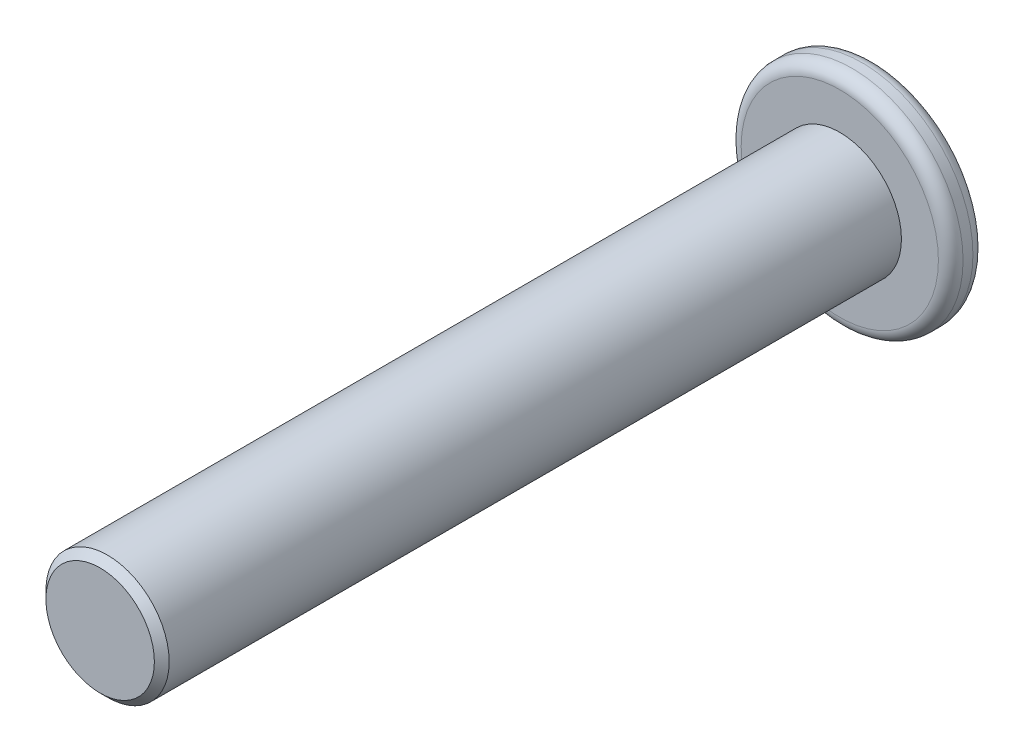
ISO-10303-21;
HEADER;
FILE_DESCRIPTION(('STEP AP214'),'2;1');
FILE_NAME('part.step','',(''),(''),'','','');
FILE_SCHEMA(('AUTOMOTIVE_DESIGN { 1 0 10303 214 1 1 1 1 }'));
ENDSEC;
DATA;
#1=APPLICATION_CONTEXT('core data for automotive mechanical design processes');
#2=APPLICATION_PROTOCOL_DEFINITION('international standard','automotive_design',2000,#1);
#3=PRODUCT_CONTEXT('',#1,'mechanical');
#4=PRODUCT('Part','Part','',(#3));
#5=PRODUCT_RELATED_PRODUCT_CATEGORY('part','',(#4));
#6=PRODUCT_DEFINITION_FORMATION('','',#4);
#7=PRODUCT_DEFINITION_CONTEXT('part definition',#1,'design');
#8=PRODUCT_DEFINITION('design','',#6,#7);
#9=PRODUCT_DEFINITION_SHAPE('','',#8);
#10=(LENGTH_UNIT() NAMED_UNIT(*) SI_UNIT(.MILLI.,.METRE.));
#11=(NAMED_UNIT(*) PLANE_ANGLE_UNIT() SI_UNIT($,.RADIAN.));
#12=(NAMED_UNIT(*) SI_UNIT($,.STERADIAN.) SOLID_ANGLE_UNIT());
#13=UNCERTAINTY_MEASURE_WITH_UNIT(LENGTH_MEASURE(1.E-05),#10,'distance_accuracy_value','');
#14=(GEOMETRIC_REPRESENTATION_CONTEXT(3) GLOBAL_UNCERTAINTY_ASSIGNED_CONTEXT((#13)) GLOBAL_UNIT_ASSIGNED_CONTEXT((#10,
#11,#12)) REPRESENTATION_CONTEXT('',''));
#15=CARTESIAN_POINT('',(0.,0.,0.));
#16=DIRECTION('',(0.,0.,1.));
#17=DIRECTION('',(1.,0.,0.));
#18=AXIS2_PLACEMENT_3D('',#15,#16,#17);
#19=CARTESIAN_POINT('',(0.,0.,1.4));
#20=DIRECTION('',(0.,0.,-1.));
#21=DIRECTION('',(-1.,0.,0.));
#22=AXIS2_PLACEMENT_3D('',#19,#20,#21);
#23=CYLINDRICAL_SURFACE('',#22,4.5);
#24=CARTESIAN_POINT('',(0.,0.,0.9));
#25=DIRECTION('',(0.,0.,1.));
#26=DIRECTION('',(1.,0.,0.));
#27=AXIS2_PLACEMENT_3D('',#24,#25,#26);
#28=CIRCLE('',#27,4.5);
#29=CARTESIAN_POINT('',(4.5,0.,0.9));
#30=VERTEX_POINT('',#29);
#31=EDGE_CURVE('E132',#30,#30,#28,.F.);
#32=ORIENTED_EDGE('',*,*,#31,.T.);
#33=EDGE_LOOP('',(#32));
#34=FACE_BOUND('',#33,.T.);
#35=CARTESIAN_POINT('',(0.,0.,0.5));
#36=DIRECTION('',(0.,0.,1.));
#37=DIRECTION('',(1.,0.,0.));
#38=AXIS2_PLACEMENT_3D('',#35,#36,#37);
#39=CIRCLE('',#38,4.5);
#40=CARTESIAN_POINT('',(4.5,0.,0.5));
#41=VERTEX_POINT('',#40);
#42=EDGE_CURVE('E129',#41,#41,#39,.T.);
#43=ORIENTED_EDGE('',*,*,#42,.T.);
#44=EDGE_LOOP('',(#43));
#45=FACE_BOUND('',#44,.T.);
#46=ADVANCED_FACE('F17',(#34,#45),#23,.T.);
#47=CARTESIAN_POINT('',(0.,0.,1.4));
#48=DIRECTION('',(0.,0.,1.));
#49=DIRECTION('',(1.,0.,0.));
#50=AXIS2_PLACEMENT_3D('',#47,#48,#49);
#51=PLANE('',#50);
#52=CARTESIAN_POINT('',(0.,0.,1.4));
#53=DIRECTION('',(0.,0.,1.));
#54=DIRECTION('',(1.,0.,0.));
#55=AXIS2_PLACEMENT_3D('',#52,#53,#54);
#56=CIRCLE('',#55,2.5);
#57=CARTESIAN_POINT('',(2.5,0.,1.4));
#58=VERTEX_POINT('',#57);
#59=EDGE_CURVE('E118',#58,#58,#56,.T.);
#60=ORIENTED_EDGE('',*,*,#59,.F.);
#61=EDGE_LOOP('',(#60));
#62=FACE_BOUND('',#61,.T.);
#63=CARTESIAN_POINT('',(0.,0.,1.4));
#64=DIRECTION('',(0.,0.,1.));
#65=DIRECTION('',(1.,0.,0.));
#66=AXIS2_PLACEMENT_3D('',#63,#64,#65);
#67=CIRCLE('',#66,4.);
#68=CARTESIAN_POINT('',(4.,0.,1.4));
#69=VERTEX_POINT('',#68);
#70=EDGE_CURVE('E126',#69,#69,#67,.T.);
#71=ORIENTED_EDGE('',*,*,#70,.T.);
#72=EDGE_LOOP('',(#71));
#73=FACE_BOUND('',#72,.T.);
#74=ADVANCED_FACE('F158',(#62,#73),#51,.T.);
#75=CARTESIAN_POINT('',(0.,0.,0.));
#76=DIRECTION('',(0.,0.,1.));
#77=DIRECTION('',(1.,0.,0.));
#78=AXIS2_PLACEMENT_3D('',#75,#76,#77);
#79=PLANE('',#78);
#80=DIRECTION('',(0.5,0.866025403784439,0.));
#81=VECTOR('',#80,1.);
#82=CARTESIAN_POINT('',(-1.73205080756888,0.,0.));
#83=LINE('',#82,#81);
#84=CARTESIAN_POINT('',(-1.73205080756888,0.,0.));
#85=VERTEX_POINT('',#84);
#86=CARTESIAN_POINT('',(-0.866025403784438,1.5,0.));
#87=VERTEX_POINT('',#86);
#88=EDGE_CURVE('E106',#85,#87,#83,.T.);
#89=ORIENTED_EDGE('',*,*,#88,.F.);
#90=DIRECTION('',(-0.5,0.866025403784439,0.));
#91=VECTOR('',#90,1.);
#92=CARTESIAN_POINT('',(-0.866025403784439,-1.5,0.));
#93=LINE('',#92,#91);
#94=CARTESIAN_POINT('',(-0.866025403784439,-1.5,0.));
#95=VERTEX_POINT('',#94);
#96=EDGE_CURVE('E32',#95,#85,#93,.T.);
#97=ORIENTED_EDGE('',*,*,#96,.F.);
#98=DIRECTION('',(-1.,0.,0.));
#99=VECTOR('',#98,1.);
#100=CARTESIAN_POINT('',(0.866025403784439,-1.5,0.));
#101=LINE('',#100,#99);
#102=CARTESIAN_POINT('',(0.866025403784439,-1.5,0.));
#103=VERTEX_POINT('',#102);
#104=EDGE_CURVE('E113',#103,#95,#101,.T.);
#105=ORIENTED_EDGE('',*,*,#104,.F.);
#106=DIRECTION('',(-0.5,-0.866025403784439,0.));
#107=VECTOR('',#106,1.);
#108=CARTESIAN_POINT('',(1.73205080756888,0.,0.));
#109=LINE('',#108,#107);
#110=CARTESIAN_POINT('',(1.73205080756888,0.,0.));
#111=VERTEX_POINT('',#110);
#112=EDGE_CURVE('E114',#111,#103,#109,.T.);
#113=ORIENTED_EDGE('',*,*,#112,.F.);
#114=DIRECTION('',(0.5,-0.866025403784439,0.));
#115=VECTOR('',#114,1.);
#116=CARTESIAN_POINT('',(0.86602540378444,1.5,0.));
#117=LINE('',#116,#115);
#118=CARTESIAN_POINT('',(0.86602540378444,1.5,0.));
#119=VERTEX_POINT('',#118);
#120=EDGE_CURVE('E79',#119,#111,#117,.T.);
#121=ORIENTED_EDGE('',*,*,#120,.F.);
#122=DIRECTION('',(1.,0.,0.));
#123=VECTOR('',#122,1.);
#124=CARTESIAN_POINT('',(-0.866025403784438,1.5,0.));
#125=LINE('',#124,#123);
#126=EDGE_CURVE('E108',#87,#119,#125,.T.);
#127=ORIENTED_EDGE('',*,*,#126,.F.);
#128=EDGE_LOOP('',(#89,#97,#105,#113,#121,#127));
#129=FACE_BOUND('',#128,.T.);
#130=CARTESIAN_POINT('',(0.,0.,0.));
#131=DIRECTION('',(0.,0.,1.));
#132=DIRECTION('',(1.,0.,0.));
#133=AXIS2_PLACEMENT_3D('',#130,#131,#132);
#134=CIRCLE('',#133,4.);
#135=CARTESIAN_POINT('',(4.,0.,0.));
#136=VERTEX_POINT('',#135);
#137=EDGE_CURVE('E137',#136,#136,#134,.F.);
#138=ORIENTED_EDGE('',*,*,#137,.T.);
#139=EDGE_LOOP('',(#138));
#140=FACE_BOUND('',#139,.T.);
#141=ADVANCED_FACE('F164',(#129,#140),#79,.F.);
#142=CARTESIAN_POINT('',(0.,0.,0.9));
#143=DIRECTION('',(0.,0.,1.));
#144=DIRECTION('',(1.,0.,0.));
#145=AXIS2_PLACEMENT_3D('',#142,#143,#144);
#146=TOROIDAL_SURFACE('',#145,4.,0.5);
#147=ORIENTED_EDGE('',*,*,#31,.F.);
#148=EDGE_LOOP('',(#147));
#149=FACE_BOUND('',#148,.T.);
#150=ORIENTED_EDGE('',*,*,#70,.F.);
#151=EDGE_LOOP('',(#150));
#152=FACE_BOUND('',#151,.T.);
#153=ADVANCED_FACE('F171',(#149,#152),#146,.T.);
#154=CARTESIAN_POINT('',(0.,0.,0.5));
#155=DIRECTION('',(0.,0.,1.));
#156=DIRECTION('',(1.,0.,0.));
#157=AXIS2_PLACEMENT_3D('',#154,#155,#156);
#158=TOROIDAL_SURFACE('',#157,4.,0.5);
#159=ORIENTED_EDGE('',*,*,#137,.F.);
#160=EDGE_LOOP('',(#159));
#161=FACE_BOUND('',#160,.T.);
#162=ORIENTED_EDGE('',*,*,#42,.F.);
#163=EDGE_LOOP('',(#162));
#164=FACE_BOUND('',#163,.T.);
#165=ADVANCED_FACE('F174',(#161,#164),#158,.T.);
#166=CARTESIAN_POINT('',(0.,0.,31.4));
#167=DIRECTION('',(0.,0.,-1.));
#168=DIRECTION('',(-1.,0.,0.));
#169=AXIS2_PLACEMENT_3D('',#166,#167,#168);
#170=CYLINDRICAL_SURFACE('',#169,2.5);
#171=CARTESIAN_POINT('',(0.,0.,31.1));
#172=DIRECTION('',(0.,0.,1.));
#173=DIRECTION('',(1.,0.,0.));
#174=AXIS2_PLACEMENT_3D('',#171,#172,#173);
#175=CIRCLE('',#174,2.5);
#176=CARTESIAN_POINT('',(2.5,0.,31.1));
#177=VERTEX_POINT('',#176);
#178=EDGE_CURVE('E11',#177,#177,#175,.F.);
#179=ORIENTED_EDGE('',*,*,#178,.T.);
#180=EDGE_LOOP('',(#179));
#181=FACE_BOUND('',#180,.T.);
#182=ORIENTED_EDGE('',*,*,#59,.T.);
#183=EDGE_LOOP('',(#182));
#184=FACE_BOUND('',#183,.T.);
#185=ADVANCED_FACE('F152',(#181,#184),#170,.T.);
#186=CARTESIAN_POINT('',(0.,0.,31.4));
#187=DIRECTION('',(0.,0.,1.));
#188=DIRECTION('',(1.,0.,0.));
#189=AXIS2_PLACEMENT_3D('',#186,#187,#188);
#190=PLANE('',#189);
#191=CARTESIAN_POINT('',(0.,0.,31.4));
#192=DIRECTION('',(0.,0.,1.));
#193=DIRECTION('',(1.,0.,0.));
#194=AXIS2_PLACEMENT_3D('',#191,#192,#193);
#195=CIRCLE('',#194,2.2);
#196=CARTESIAN_POINT('',(2.2,0.,31.4));
#197=VERTEX_POINT('',#196);
#198=EDGE_CURVE('E25',#197,#197,#195,.T.);
#199=ORIENTED_EDGE('',*,*,#198,.T.);
#200=EDGE_LOOP('',(#199));
#201=FACE_BOUND('',#200,.T.);
#202=ADVANCED_FACE('F143',(#201),#190,.T.);
#203=CARTESIAN_POINT('',(0.,0.,31.4));
#204=DIRECTION('',(0.,0.,-1.));
#205=DIRECTION('',(-1.,0.,0.));
#206=AXIS2_PLACEMENT_3D('',#203,#204,#205);
#207=CONICAL_SURFACE('',#206,2.2,0.78539816339745);
#208=ORIENTED_EDGE('',*,*,#178,.F.);
#209=EDGE_LOOP('',(#208));
#210=FACE_BOUND('',#209,.T.);
#211=ORIENTED_EDGE('',*,*,#198,.F.);
#212=EDGE_LOOP('',(#211));
#213=FACE_BOUND('',#212,.T.);
#214=ADVANCED_FACE('F19',(#210,#213),#207,.T.);
#215=CARTESIAN_POINT('',(-0.866025403784439,-1.5,2.));
#216=DIRECTION('',(-0.866025403784439,-0.5,0.));
#217=DIRECTION('',(0.5,-0.866025403784439,0.));
#218=AXIS2_PLACEMENT_3D('',#215,#216,#217);
#219=PLANE('',#218);
#220=ORIENTED_EDGE('',*,*,#96,.T.);
#221=DIRECTION('',(0.,0.,-1.));
#222=VECTOR('',#221,1.);
#223=CARTESIAN_POINT('',(-1.73205080756888,0.,2.));
#224=LINE('',#223,#222);
#225=CARTESIAN_POINT('',(-1.73205080756888,0.,2.));
#226=VERTEX_POINT('',#225);
#227=EDGE_CURVE('E62',#226,#85,#224,.T.);
#228=ORIENTED_EDGE('',*,*,#227,.F.);
#229=DIRECTION('',(-0.5,0.866025403784439,0.));
#230=VECTOR('',#229,1.);
#231=CARTESIAN_POINT('',(-0.866025403784439,-1.5,2.));
#232=LINE('',#231,#230);
#233=CARTESIAN_POINT('',(-0.866025403784439,-1.5,2.));
#234=VERTEX_POINT('',#233);
#235=EDGE_CURVE('E117',#234,#226,#232,.T.);
#236=ORIENTED_EDGE('',*,*,#235,.F.);
#237=DIRECTION('',(0.,0.,-1.));
#238=VECTOR('',#237,1.);
#239=CARTESIAN_POINT('',(-0.866025403784439,-1.5,2.));
#240=LINE('',#239,#238);
#241=EDGE_CURVE('E37',#234,#95,#240,.T.);
#242=ORIENTED_EDGE('',*,*,#241,.T.);
#243=EDGE_LOOP('',(#220,#228,#236,#242));
#244=FACE_BOUND('',#243,.T.);
#245=ADVANCED_FACE('F145',(#244),#219,.F.);
#246=CARTESIAN_POINT('',(0.866025403784439,-1.5,2.));
#247=DIRECTION('',(0.,-1.,0.));
#248=DIRECTION('',(1.,0.,0.));
#249=AXIS2_PLACEMENT_3D('',#246,#247,#248);
#250=PLANE('',#249);
#251=ORIENTED_EDGE('',*,*,#104,.T.);
#252=ORIENTED_EDGE('',*,*,#241,.F.);
#253=DIRECTION('',(-1.,0.,0.));
#254=VECTOR('',#253,1.);
#255=CARTESIAN_POINT('',(0.866025403784439,-1.5,2.));
#256=LINE('',#255,#254);
#257=CARTESIAN_POINT('',(0.866025403784439,-1.5,2.));
#258=VERTEX_POINT('',#257);
#259=EDGE_CURVE('E95',#258,#234,#256,.T.);
#260=ORIENTED_EDGE('',*,*,#259,.F.);
#261=DIRECTION('',(0.,0.,-1.));
#262=VECTOR('',#261,1.);
#263=CARTESIAN_POINT('',(0.866025403784439,-1.5,2.));
#264=LINE('',#263,#262);
#265=EDGE_CURVE('E81',#258,#103,#264,.T.);
#266=ORIENTED_EDGE('',*,*,#265,.T.);
#267=EDGE_LOOP('',(#251,#252,#260,#266));
#268=FACE_BOUND('',#267,.T.);
#269=ADVANCED_FACE('F155',(#268),#250,.F.);
#270=CARTESIAN_POINT('',(1.73205080756888,0.,2.));
#271=DIRECTION('',(0.866025403784439,-0.5,0.));
#272=DIRECTION('',(0.5,0.866025403784439,0.));
#273=AXIS2_PLACEMENT_3D('',#270,#271,#272);
#274=PLANE('',#273);
#275=ORIENTED_EDGE('',*,*,#112,.T.);
#276=ORIENTED_EDGE('',*,*,#265,.F.);
#277=DIRECTION('',(-0.5,-0.866025403784439,0.));
#278=VECTOR('',#277,1.);
#279=CARTESIAN_POINT('',(1.73205080756888,0.,2.));
#280=LINE('',#279,#278);
#281=CARTESIAN_POINT('',(1.73205080756888,0.,2.));
#282=VERTEX_POINT('',#281);
#283=EDGE_CURVE('E86',#282,#258,#280,.T.);
#284=ORIENTED_EDGE('',*,*,#283,.F.);
#285=DIRECTION('',(0.,0.,-1.));
#286=VECTOR('',#285,1.);
#287=CARTESIAN_POINT('',(1.73205080756888,0.,2.));
#288=LINE('',#287,#286);
#289=EDGE_CURVE('E73',#282,#111,#288,.T.);
#290=ORIENTED_EDGE('',*,*,#289,.T.);
#291=EDGE_LOOP('',(#275,#276,#284,#290));
#292=FACE_BOUND('',#291,.T.);
#293=ADVANCED_FACE('F90',(#292),#274,.F.);
#294=CARTESIAN_POINT('',(0.86602540378444,1.5,2.));
#295=DIRECTION('',(0.866025403784439,0.5,0.));
#296=DIRECTION('',(-0.5,0.866025403784439,0.));
#297=AXIS2_PLACEMENT_3D('',#294,#295,#296);
#298=PLANE('',#297);
#299=ORIENTED_EDGE('',*,*,#120,.T.);
#300=ORIENTED_EDGE('',*,*,#289,.F.);
#301=DIRECTION('',(0.5,-0.866025403784439,0.));
#302=VECTOR('',#301,1.);
#303=CARTESIAN_POINT('',(0.86602540378444,1.5,2.));
#304=LINE('',#303,#302);
#305=CARTESIAN_POINT('',(0.86602540378444,1.5,2.));
#306=VERTEX_POINT('',#305);
#307=EDGE_CURVE('E80',#306,#282,#304,.T.);
#308=ORIENTED_EDGE('',*,*,#307,.F.);
#309=DIRECTION('',(0.,0.,-1.));
#310=VECTOR('',#309,1.);
#311=CARTESIAN_POINT('',(0.86602540378444,1.5,2.));
#312=LINE('',#311,#310);
#313=EDGE_CURVE('E83',#306,#119,#312,.T.);
#314=ORIENTED_EDGE('',*,*,#313,.T.);
#315=EDGE_LOOP('',(#299,#300,#308,#314));
#316=FACE_BOUND('',#315,.T.);
#317=ADVANCED_FACE('F74',(#316),#298,.F.);
#318=CARTESIAN_POINT('',(-0.866025403784438,1.5,2.));
#319=DIRECTION('',(0.,1.,0.));
#320=DIRECTION('',(-1.,0.,0.));
#321=AXIS2_PLACEMENT_3D('',#318,#319,#320);
#322=PLANE('',#321);
#323=ORIENTED_EDGE('',*,*,#126,.T.);
#324=ORIENTED_EDGE('',*,*,#313,.F.);
#325=DIRECTION('',(1.,0.,0.));
#326=VECTOR('',#325,1.);
#327=CARTESIAN_POINT('',(-0.866025403784438,1.5,2.));
#328=LINE('',#327,#326);
#329=CARTESIAN_POINT('',(-0.866025403784438,1.5,2.));
#330=VERTEX_POINT('',#329);
#331=EDGE_CURVE('E98',#330,#306,#328,.T.);
#332=ORIENTED_EDGE('',*,*,#331,.F.);
#333=DIRECTION('',(0.,0.,-1.));
#334=VECTOR('',#333,1.);
#335=CARTESIAN_POINT('',(-0.866025403784438,1.5,2.));
#336=LINE('',#335,#334);
#337=EDGE_CURVE('E121',#330,#87,#336,.T.);
#338=ORIENTED_EDGE('',*,*,#337,.T.);
#339=EDGE_LOOP('',(#323,#324,#332,#338));
#340=FACE_BOUND('',#339,.T.);
#341=ADVANCED_FACE('F207',(#340),#322,.F.);
#342=CARTESIAN_POINT('',(-1.73205080756888,0.,2.));
#343=DIRECTION('',(-0.866025403784439,0.5,0.));
#344=DIRECTION('',(-0.5,-0.866025403784439,0.));
#345=AXIS2_PLACEMENT_3D('',#342,#343,#344);
#346=PLANE('',#345);
#347=ORIENTED_EDGE('',*,*,#88,.T.);
#348=ORIENTED_EDGE('',*,*,#337,.F.);
#349=DIRECTION('',(0.5,0.866025403784439,0.));
#350=VECTOR('',#349,1.);
#351=CARTESIAN_POINT('',(-1.73205080756888,0.,2.));
#352=LINE('',#351,#350);
#353=EDGE_CURVE('E99',#226,#330,#352,.T.);
#354=ORIENTED_EDGE('',*,*,#353,.F.);
#355=ORIENTED_EDGE('',*,*,#227,.T.);
#356=EDGE_LOOP('',(#347,#348,#354,#355));
#357=FACE_BOUND('',#356,.T.);
#358=ADVANCED_FACE('F198',(#357),#346,.F.);
#359=CARTESIAN_POINT('',(0.,0.,2.));
#360=DIRECTION('',(0.,0.,-1.));
#361=DIRECTION('',(-1.,0.,0.));
#362=AXIS2_PLACEMENT_3D('',#359,#360,#361);
#363=PLANE('',#362);
#364=ORIENTED_EDGE('',*,*,#235,.T.);
#365=ORIENTED_EDGE('',*,*,#353,.T.);
#366=ORIENTED_EDGE('',*,*,#331,.T.);
#367=ORIENTED_EDGE('',*,*,#307,.T.);
#368=ORIENTED_EDGE('',*,*,#283,.T.);
#369=ORIENTED_EDGE('',*,*,#259,.T.);
#370=EDGE_LOOP('',(#364,#365,#366,#367,#368,#369));
#371=FACE_BOUND('',#370,.T.);
#372=ADVANCED_FACE('F92',(#371),#363,.T.);
#373=CLOSED_SHELL('',(#46,#74,#141,#153,#165,#185,#202,#214,#245,#269,#293,#317,#341,#358,#372));
#374=MANIFOLD_SOLID_BREP('B1',#373);
#375=ADVANCED_BREP_SHAPE_REPRESENTATION('',(#18,#374),#14);
#376=SHAPE_DEFINITION_REPRESENTATION(#9,#375);
ENDSEC;
END-ISO-10303-21;
